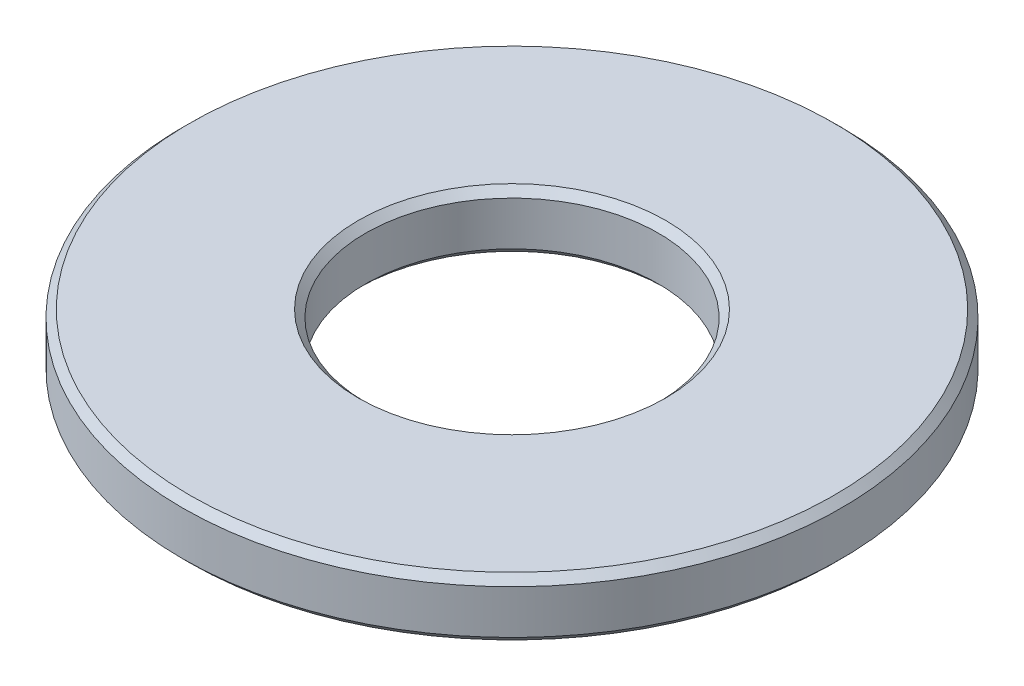
ISO-10303-21;
HEADER;
FILE_DESCRIPTION(('STEP AP214'),'2;1');
FILE_NAME('part.step','',(''),(''),'','','');
FILE_SCHEMA(('AUTOMOTIVE_DESIGN { 1 0 10303 214 1 1 1 1 }'));
ENDSEC;
DATA;
#1=APPLICATION_CONTEXT('core data for automotive mechanical design processes');
#2=APPLICATION_PROTOCOL_DEFINITION('international standard','automotive_design',2000,#1);
#3=PRODUCT_CONTEXT('',#1,'mechanical');
#4=PRODUCT('Part','Part','',(#3));
#5=PRODUCT_RELATED_PRODUCT_CATEGORY('part','',(#4));
#6=PRODUCT_DEFINITION_FORMATION('','',#4);
#7=PRODUCT_DEFINITION_CONTEXT('part definition',#1,'design');
#8=PRODUCT_DEFINITION('design','',#6,#7);
#9=PRODUCT_DEFINITION_SHAPE('','',#8);
#10=(LENGTH_UNIT() NAMED_UNIT(*) SI_UNIT(.MILLI.,.METRE.));
#11=(NAMED_UNIT(*) PLANE_ANGLE_UNIT() SI_UNIT($,.RADIAN.));
#12=(NAMED_UNIT(*) SI_UNIT($,.STERADIAN.) SOLID_ANGLE_UNIT());
#13=UNCERTAINTY_MEASURE_WITH_UNIT(LENGTH_MEASURE(1.E-05),#10,'distance_accuracy_value','');
#14=(GEOMETRIC_REPRESENTATION_CONTEXT(3) GLOBAL_UNCERTAINTY_ASSIGNED_CONTEXT((#13)) GLOBAL_UNIT_ASSIGNED_CONTEXT((#10,
#11,#12)) REPRESENTATION_CONTEXT('',''));
#15=CARTESIAN_POINT('',(0.,0.,0.));
#16=DIRECTION('',(0.,0.,1.));
#17=DIRECTION('',(1.,0.,0.));
#18=AXIS2_PLACEMENT_3D('',#15,#16,#17);
#19=CARTESIAN_POINT('',(0.,0.8,0.));
#20=DIRECTION('',(0.,1.,0.));
#21=DIRECTION('',(0.,0.,1.));
#22=AXIS2_PLACEMENT_3D('',#19,#20,#21);
#23=PLANE('',#22);
#24=CARTESIAN_POINT('',(0.,0.8,0.));
#25=DIRECTION('',(0.,1.,0.));
#26=DIRECTION('',(0.,0.,1.));
#27=AXIS2_PLACEMENT_3D('',#24,#25,#26);
#28=CIRCLE('',#27,2.1);
#29=CARTESIAN_POINT('',(0.,0.8,2.1));
#30=VERTEX_POINT('',#29);
#31=EDGE_CURVE('E51',#30,#30,#28,.F.);
#32=ORIENTED_EDGE('',*,*,#31,.T.);
#33=EDGE_LOOP('',(#32));
#34=FACE_BOUND('',#33,.T.);
#35=CARTESIAN_POINT('',(0.,0.8,0.));
#36=DIRECTION('',(0.,1.,0.));
#37=DIRECTION('',(0.,0.,1.));
#38=AXIS2_PLACEMENT_3D('',#35,#36,#37);
#39=CIRCLE('',#38,4.4);
#40=CARTESIAN_POINT('',(0.,0.8,4.4));
#41=VERTEX_POINT('',#40);
#42=EDGE_CURVE('E54',#41,#41,#39,.T.);
#43=ORIENTED_EDGE('',*,*,#42,.T.);
#44=EDGE_LOOP('',(#43));
#45=FACE_BOUND('',#44,.T.);
#46=ADVANCED_FACE('F31',(#34,#45),#23,.T.);
#47=CARTESIAN_POINT('',(0.,0.,0.));
#48=DIRECTION('',(0.,1.,0.));
#49=DIRECTION('',(0.,0.,1.));
#50=AXIS2_PLACEMENT_3D('',#47,#48,#49);
#51=PLANE('',#50);
#52=CARTESIAN_POINT('',(0.,0.,0.));
#53=DIRECTION('',(0.,1.,0.));
#54=DIRECTION('',(0.,0.,1.));
#55=AXIS2_PLACEMENT_3D('',#52,#53,#54);
#56=CIRCLE('',#55,2.1);
#57=CARTESIAN_POINT('',(0.,0.,2.1));
#58=VERTEX_POINT('',#57);
#59=EDGE_CURVE('E10',#58,#58,#56,.T.);
#60=ORIENTED_EDGE('',*,*,#59,.T.);
#61=EDGE_LOOP('',(#60));
#62=FACE_BOUND('',#61,.T.);
#63=CARTESIAN_POINT('',(0.,0.,0.));
#64=DIRECTION('',(0.,1.,0.));
#65=DIRECTION('',(0.,0.,1.));
#66=AXIS2_PLACEMENT_3D('',#63,#64,#65);
#67=CIRCLE('',#66,4.4);
#68=CARTESIAN_POINT('',(0.,0.,4.4));
#69=VERTEX_POINT('',#68);
#70=EDGE_CURVE('E38',#69,#69,#67,.F.);
#71=ORIENTED_EDGE('',*,*,#70,.T.);
#72=EDGE_LOOP('',(#71));
#73=FACE_BOUND('',#72,.T.);
#74=ADVANCED_FACE('F79',(#62,#73),#51,.F.);
#75=CARTESIAN_POINT('',(0.,0.8,0.));
#76=DIRECTION('',(0.,-1.,0.));
#77=DIRECTION('',(0.,0.,-1.));
#78=AXIS2_PLACEMENT_3D('',#75,#76,#77);
#79=CYLINDRICAL_SURFACE('',#78,4.5);
#80=CARTESIAN_POINT('',(0.,0.699999999999999,0.));
#81=DIRECTION('',(0.,1.,0.));
#82=DIRECTION('',(0.,0.,1.));
#83=AXIS2_PLACEMENT_3D('',#80,#81,#82);
#84=CIRCLE('',#83,4.5);
#85=CARTESIAN_POINT('',(0.,0.699999999999999,4.5));
#86=VERTEX_POINT('',#85);
#87=EDGE_CURVE('E42',#86,#86,#84,.F.);
#88=ORIENTED_EDGE('',*,*,#87,.T.);
#89=EDGE_LOOP('',(#88));
#90=FACE_BOUND('',#89,.T.);
#91=CARTESIAN_POINT('',(0.,0.0999999999999994,0.));
#92=DIRECTION('',(0.,1.,0.));
#93=DIRECTION('',(0.,0.,1.));
#94=AXIS2_PLACEMENT_3D('',#91,#92,#93);
#95=CIRCLE('',#94,4.5);
#96=CARTESIAN_POINT('',(0.,0.0999999999999994,4.5));
#97=VERTEX_POINT('',#96);
#98=EDGE_CURVE('E46',#97,#97,#95,.T.);
#99=ORIENTED_EDGE('',*,*,#98,.T.);
#100=EDGE_LOOP('',(#99));
#101=FACE_BOUND('',#100,.T.);
#102=ADVANCED_FACE('F85',(#90,#101),#79,.T.);
#103=CARTESIAN_POINT('',(0.,0.8,0.));
#104=DIRECTION('',(0.,-1.,0.));
#105=DIRECTION('',(0.,0.,-1.));
#106=AXIS2_PLACEMENT_3D('',#103,#104,#105);
#107=CYLINDRICAL_SURFACE('',#106,2.);
#108=CARTESIAN_POINT('',(0.,0.700000000000002,0.));
#109=DIRECTION('',(0.,1.,0.));
#110=DIRECTION('',(0.,0.,1.));
#111=AXIS2_PLACEMENT_3D('',#108,#109,#110);
#112=CIRCLE('',#111,2.);
#113=CARTESIAN_POINT('',(0.,0.700000000000002,2.));
#114=VERTEX_POINT('',#113);
#115=EDGE_CURVE('E57',#114,#114,#112,.T.);
#116=ORIENTED_EDGE('',*,*,#115,.T.);
#117=EDGE_LOOP('',(#116));
#118=FACE_BOUND('',#117,.T.);
#119=CARTESIAN_POINT('',(0.,0.100000000000001,0.));
#120=DIRECTION('',(0.,1.,0.));
#121=DIRECTION('',(0.,0.,1.));
#122=AXIS2_PLACEMENT_3D('',#119,#120,#121);
#123=CIRCLE('',#122,2.);
#124=CARTESIAN_POINT('',(0.,0.100000000000001,2.));
#125=VERTEX_POINT('',#124);
#126=EDGE_CURVE('E60',#125,#125,#123,.F.);
#127=ORIENTED_EDGE('',*,*,#126,.T.);
#128=EDGE_LOOP('',(#127));
#129=FACE_BOUND('',#128,.T.);
#130=ADVANCED_FACE('F64',(#118,#129),#107,.F.);
#131=CARTESIAN_POINT('',(0.,0.700000000000002,0.));
#132=DIRECTION('',(0.,1.,0.));
#133=DIRECTION('',(0.,0.,1.));
#134=AXIS2_PLACEMENT_3D('',#131,#132,#133);
#135=CONICAL_SURFACE('',#134,2.,0.785398163397453);
#136=ORIENTED_EDGE('',*,*,#31,.F.);
#137=EDGE_LOOP('',(#136));
#138=FACE_BOUND('',#137,.T.);
#139=ORIENTED_EDGE('',*,*,#115,.F.);
#140=EDGE_LOOP('',(#139));
#141=FACE_BOUND('',#140,.T.);
#142=ADVANCED_FACE('F75',(#138,#141),#135,.F.);
#143=CARTESIAN_POINT('',(0.,0.8,0.));
#144=DIRECTION('',(0.,-1.,0.));
#145=DIRECTION('',(0.,0.,-1.));
#146=AXIS2_PLACEMENT_3D('',#143,#144,#145);
#147=CONICAL_SURFACE('',#146,4.4,0.785398163397457);
#148=ORIENTED_EDGE('',*,*,#87,.F.);
#149=EDGE_LOOP('',(#148));
#150=FACE_BOUND('',#149,.T.);
#151=ORIENTED_EDGE('',*,*,#42,.F.);
#152=EDGE_LOOP('',(#151));
#153=FACE_BOUND('',#152,.T.);
#154=ADVANCED_FACE('F69',(#150,#153),#147,.T.);
#155=CARTESIAN_POINT('',(0.,0.,0.));
#156=DIRECTION('',(0.,-1.,0.));
#157=DIRECTION('',(0.,0.,-1.));
#158=AXIS2_PLACEMENT_3D('',#155,#156,#157);
#159=CONICAL_SURFACE('',#158,2.1,0.785398163397444);
#160=ORIENTED_EDGE('',*,*,#126,.F.);
#161=EDGE_LOOP('',(#160));
#162=FACE_BOUND('',#161,.T.);
#163=ORIENTED_EDGE('',*,*,#59,.F.);
#164=EDGE_LOOP('',(#163));
#165=FACE_BOUND('',#164,.T.);
#166=ADVANCED_FACE('F66',(#162,#165),#159,.F.);
#167=CARTESIAN_POINT('',(0.,0.0999999999999994,0.));
#168=DIRECTION('',(0.,1.,0.));
#169=DIRECTION('',(0.,0.,1.));
#170=AXIS2_PLACEMENT_3D('',#167,#168,#169);
#171=CONICAL_SURFACE('',#170,4.5,0.785398163397448);
#172=ORIENTED_EDGE('',*,*,#70,.F.);
#173=EDGE_LOOP('',(#172));
#174=FACE_BOUND('',#173,.T.);
#175=ORIENTED_EDGE('',*,*,#98,.F.);
#176=EDGE_LOOP('',(#175));
#177=FACE_BOUND('',#176,.T.);
#178=ADVANCED_FACE('F33',(#174,#177),#171,.T.);
#179=CLOSED_SHELL('',(#46,#74,#102,#130,#142,#154,#166,#178));
#180=MANIFOLD_SOLID_BREP('B2',#179);
#181=ADVANCED_BREP_SHAPE_REPRESENTATION('',(#18,#180),#14);
#182=SHAPE_DEFINITION_REPRESENTATION(#9,#181);
ENDSEC;
END-ISO-10303-21;
